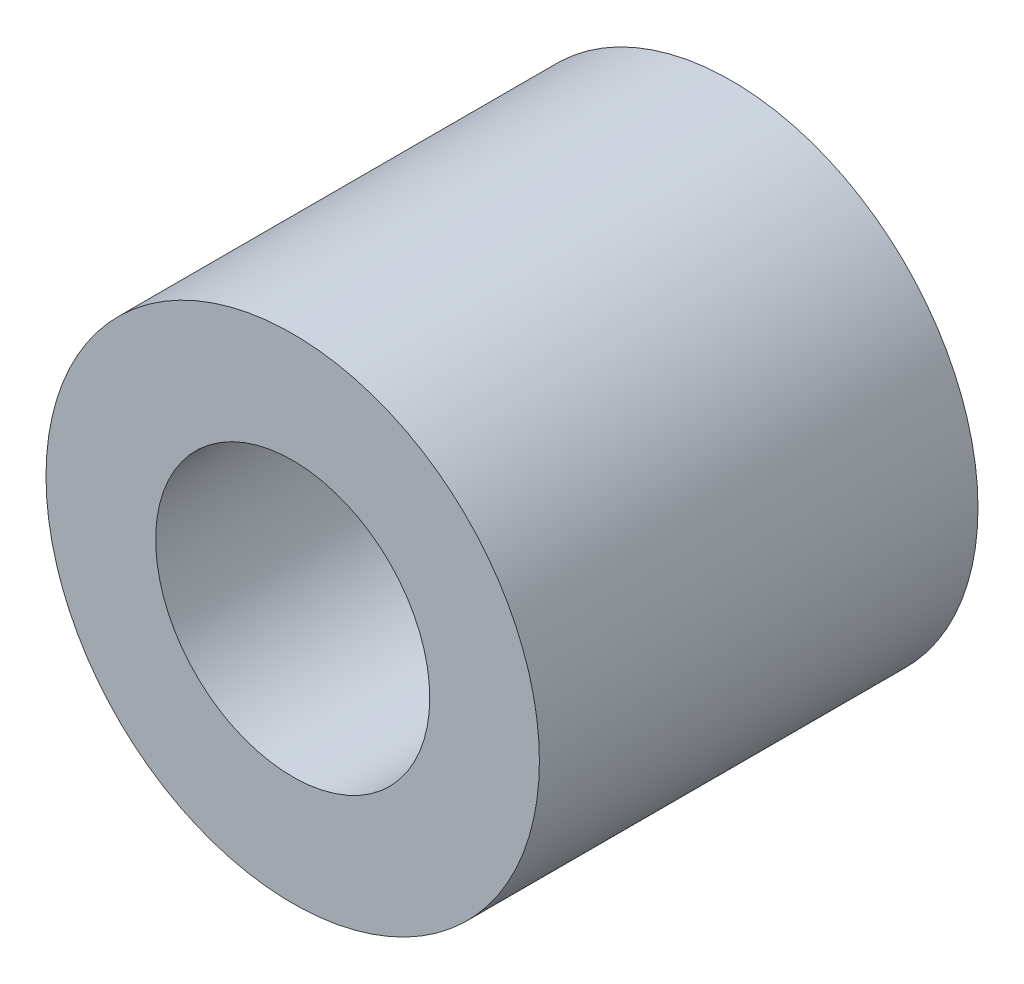
ISO-10303-21;
HEADER;
FILE_DESCRIPTION(('STEP AP214'),'2;1');
FILE_NAME('part.step','',(''),(''),'','','');
FILE_SCHEMA(('AUTOMOTIVE_DESIGN { 1 0 10303 214 1 1 1 1 }'));
ENDSEC;
DATA;
#1=APPLICATION_CONTEXT('core data for automotive mechanical design processes');
#2=APPLICATION_PROTOCOL_DEFINITION('international standard','automotive_design',2000,#1);
#3=PRODUCT_CONTEXT('',#1,'mechanical');
#4=PRODUCT('Part','Part','',(#3));
#5=PRODUCT_RELATED_PRODUCT_CATEGORY('part','',(#4));
#6=PRODUCT_DEFINITION_FORMATION('','',#4);
#7=PRODUCT_DEFINITION_CONTEXT('part definition',#1,'design');
#8=PRODUCT_DEFINITION('design','',#6,#7);
#9=PRODUCT_DEFINITION_SHAPE('','',#8);
#10=(LENGTH_UNIT() NAMED_UNIT(*) SI_UNIT(.MILLI.,.METRE.));
#11=(NAMED_UNIT(*) PLANE_ANGLE_UNIT() SI_UNIT($,.RADIAN.));
#12=(NAMED_UNIT(*) SI_UNIT($,.STERADIAN.) SOLID_ANGLE_UNIT());
#13=UNCERTAINTY_MEASURE_WITH_UNIT(LENGTH_MEASURE(1.E-05),#10,'distance_accuracy_value','');
#14=(GEOMETRIC_REPRESENTATION_CONTEXT(3) GLOBAL_UNCERTAINTY_ASSIGNED_CONTEXT((#13)) GLOBAL_UNIT_ASSIGNED_CONTEXT((#10,
#11,#12)) REPRESENTATION_CONTEXT('',''));
#15=CARTESIAN_POINT('',(0.,0.,0.));
#16=DIRECTION('',(0.,0.,1.));
#17=DIRECTION('',(1.,0.,0.));
#18=AXIS2_PLACEMENT_3D('',#15,#16,#17);
#19=CARTESIAN_POINT('',(0.,0.,16.));
#20=DIRECTION('',(0.,0.,1.));
#21=DIRECTION('',(1.,0.,0.));
#22=AXIS2_PLACEMENT_3D('',#19,#20,#21);
#23=PLANE('',#22);
#24=CARTESIAN_POINT('',(0.,0.,16.));
#25=DIRECTION('',(0.,0.,1.));
#26=DIRECTION('',(1.,0.,0.));
#27=AXIS2_PLACEMENT_3D('',#24,#25,#26);
#28=CIRCLE('',#27,9.);
#29=CARTESIAN_POINT('',(9.,0.,16.));
#30=VERTEX_POINT('',#29);
#31=EDGE_CURVE('E10',#30,#30,#28,.T.);
#32=ORIENTED_EDGE('',*,*,#31,.T.);
#33=EDGE_LOOP('',(#32));
#34=FACE_BOUND('',#33,.T.);
#35=CARTESIAN_POINT('',(0.,0.,16.));
#36=DIRECTION('',(0.,0.,1.));
#37=DIRECTION('',(1.,0.,0.));
#38=AXIS2_PLACEMENT_3D('',#35,#36,#37);
#39=CIRCLE('',#38,5.);
#40=CARTESIAN_POINT('',(5.,0.,16.));
#41=VERTEX_POINT('',#40);
#42=EDGE_CURVE('E44',#41,#41,#39,.T.);
#43=ORIENTED_EDGE('',*,*,#42,.F.);
#44=EDGE_LOOP('',(#43));
#45=FACE_BOUND('',#44,.T.);
#46=ADVANCED_FACE('F33',(#34,#45),#23,.T.);
#47=CARTESIAN_POINT('',(0.,0.,0.));
#48=DIRECTION('',(0.,0.,1.));
#49=DIRECTION('',(1.,0.,0.));
#50=AXIS2_PLACEMENT_3D('',#47,#48,#49);
#51=PLANE('',#50);
#52=CARTESIAN_POINT('',(0.,0.,0.));
#53=DIRECTION('',(0.,0.,1.));
#54=DIRECTION('',(1.,0.,0.));
#55=AXIS2_PLACEMENT_3D('',#52,#53,#54);
#56=CIRCLE('',#55,9.);
#57=CARTESIAN_POINT('',(9.,0.,0.));
#58=VERTEX_POINT('',#57);
#59=EDGE_CURVE('E37',#58,#58,#56,.T.);
#60=ORIENTED_EDGE('',*,*,#59,.F.);
#61=EDGE_LOOP('',(#60));
#62=FACE_BOUND('',#61,.T.);
#63=CARTESIAN_POINT('',(0.,0.,0.));
#64=DIRECTION('',(0.,0.,1.));
#65=DIRECTION('',(1.,0.,0.));
#66=AXIS2_PLACEMENT_3D('',#63,#64,#65);
#67=CIRCLE('',#66,5.);
#68=CARTESIAN_POINT('',(5.,0.,0.));
#69=VERTEX_POINT('',#68);
#70=EDGE_CURVE('E46',#69,#69,#67,.T.);
#71=ORIENTED_EDGE('',*,*,#70,.T.);
#72=EDGE_LOOP('',(#71));
#73=FACE_BOUND('',#72,.T.);
#74=ADVANCED_FACE('F56',(#62,#73),#51,.F.);
#75=CARTESIAN_POINT('',(0.,0.,16.));
#76=DIRECTION('',(0.,0.,-1.));
#77=DIRECTION('',(-1.,0.,0.));
#78=AXIS2_PLACEMENT_3D('',#75,#76,#77);
#79=CYLINDRICAL_SURFACE('',#78,9.);
#80=ORIENTED_EDGE('',*,*,#31,.F.);
#81=EDGE_LOOP('',(#80));
#82=FACE_BOUND('',#81,.T.);
#83=ORIENTED_EDGE('',*,*,#59,.T.);
#84=EDGE_LOOP('',(#83));
#85=FACE_BOUND('',#84,.T.);
#86=ADVANCED_FACE('F35',(#82,#85),#79,.T.);
#87=CARTESIAN_POINT('',(0.,0.,16.));
#88=DIRECTION('',(0.,0.,-1.));
#89=DIRECTION('',(-1.,0.,0.));
#90=AXIS2_PLACEMENT_3D('',#87,#88,#89);
#91=CYLINDRICAL_SURFACE('',#90,5.);
#92=ORIENTED_EDGE('',*,*,#42,.T.);
#93=EDGE_LOOP('',(#92));
#94=FACE_BOUND('',#93,.T.);
#95=ORIENTED_EDGE('',*,*,#70,.F.);
#96=EDGE_LOOP('',(#95));
#97=FACE_BOUND('',#96,.T.);
#98=ADVANCED_FACE('F52',(#94,#97),#91,.F.);
#99=CLOSED_SHELL('',(#46,#74,#86,#98));
#100=MANIFOLD_SOLID_BREP('B2',#99);
#101=ADVANCED_BREP_SHAPE_REPRESENTATION('',(#18,#100),#14);
#102=SHAPE_DEFINITION_REPRESENTATION(#9,#101);
ENDSEC;
END-ISO-10303-21;
